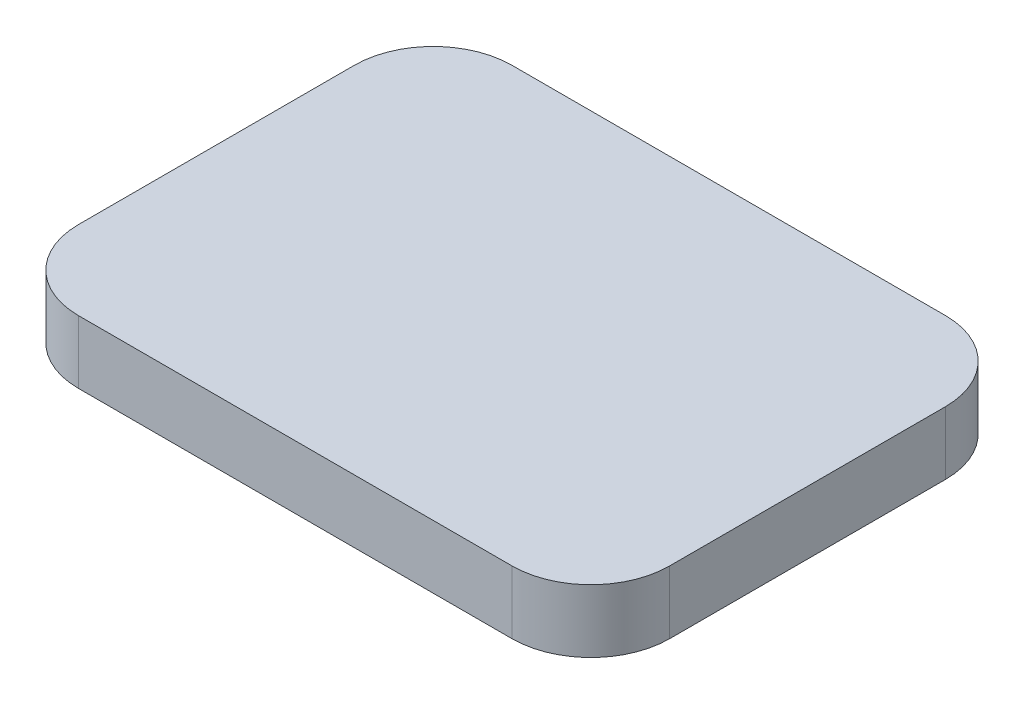
ISO-10303-21;
HEADER;
FILE_DESCRIPTION(('STEP AP214'),'2;1');
FILE_NAME('part.step','',(''),(''),'','','');
FILE_SCHEMA(('AUTOMOTIVE_DESIGN { 1 0 10303 214 1 1 1 1 }'));
ENDSEC;
DATA;
#1=APPLICATION_CONTEXT('core data for automotive mechanical design processes');
#2=APPLICATION_PROTOCOL_DEFINITION('international standard','automotive_design',2000,#1);
#3=PRODUCT_CONTEXT('',#1,'mechanical');
#4=PRODUCT('Part','Part','',(#3));
#5=PRODUCT_RELATED_PRODUCT_CATEGORY('part','',(#4));
#6=PRODUCT_DEFINITION_FORMATION('','',#4);
#7=PRODUCT_DEFINITION_CONTEXT('part definition',#1,'design');
#8=PRODUCT_DEFINITION('design','',#6,#7);
#9=PRODUCT_DEFINITION_SHAPE('','',#8);
#10=(LENGTH_UNIT() NAMED_UNIT(*) SI_UNIT(.MILLI.,.METRE.));
#11=(NAMED_UNIT(*) PLANE_ANGLE_UNIT() SI_UNIT($,.RADIAN.));
#12=(NAMED_UNIT(*) SI_UNIT($,.STERADIAN.) SOLID_ANGLE_UNIT());
#13=UNCERTAINTY_MEASURE_WITH_UNIT(LENGTH_MEASURE(1.E-05),#10,'distance_accuracy_value','');
#14=(GEOMETRIC_REPRESENTATION_CONTEXT(3) GLOBAL_UNCERTAINTY_ASSIGNED_CONTEXT((#13)) GLOBAL_UNIT_ASSIGNED_CONTEXT((#10,
#11,#12)) REPRESENTATION_CONTEXT('',''));
#15=CARTESIAN_POINT('',(0.,0.,0.));
#16=DIRECTION('',(0.,0.,1.));
#17=DIRECTION('',(1.,0.,0.));
#18=AXIS2_PLACEMENT_3D('',#15,#16,#17);
#19=CARTESIAN_POINT('',(7.5,1.6,-5.5));
#20=DIRECTION('',(-1.,0.,0.));
#21=DIRECTION('',(0.,0.,1.));
#22=AXIS2_PLACEMENT_3D('',#19,#20,#21);
#23=PLANE('',#22);
#24=DIRECTION('',(0.,0.,-1.));
#25=VECTOR('',#24,1.);
#26=CARTESIAN_POINT('',(7.5,0.,-5.5));
#27=LINE('',#26,#25);
#28=CARTESIAN_POINT('',(7.5,0.,3.5));
#29=VERTEX_POINT('',#28);
#30=CARTESIAN_POINT('',(7.5,0.,-3.5));
#31=VERTEX_POINT('',#30);
#32=EDGE_CURVE('E130',#29,#31,#27,.T.);
#33=ORIENTED_EDGE('',*,*,#32,.T.);
#34=DIRECTION('',(0.,-1.,0.));
#35=VECTOR('',#34,1.);
#36=CARTESIAN_POINT('',(7.5,1.6,-3.5));
#37=LINE('',#36,#35);
#38=CARTESIAN_POINT('',(7.5,1.6,-3.5));
#39=VERTEX_POINT('',#38);
#40=EDGE_CURVE('E152',#31,#39,#37,.F.);
#41=ORIENTED_EDGE('',*,*,#40,.T.);
#42=DIRECTION('',(0.,0.,-1.));
#43=VECTOR('',#42,1.);
#44=CARTESIAN_POINT('',(7.5,1.6,-5.5));
#45=LINE('',#44,#43);
#46=CARTESIAN_POINT('',(7.5,1.6,3.5));
#47=VERTEX_POINT('',#46);
#48=EDGE_CURVE('E128',#47,#39,#45,.T.);
#49=ORIENTED_EDGE('',*,*,#48,.F.);
#50=DIRECTION('',(0.,-1.,0.));
#51=VECTOR('',#50,1.);
#52=CARTESIAN_POINT('',(7.5,1.6,3.5));
#53=LINE('',#52,#51);
#54=EDGE_CURVE('E149',#47,#29,#53,.T.);
#55=ORIENTED_EDGE('',*,*,#54,.T.);
#56=EDGE_LOOP('',(#33,#41,#49,#55));
#57=FACE_BOUND('',#56,.T.);
#58=ADVANCED_FACE('F33',(#57),#23,.F.);
#59=CARTESIAN_POINT('',(-7.5,1.6,-5.5));
#60=DIRECTION('',(0.,0.,1.));
#61=DIRECTION('',(1.,0.,0.));
#62=AXIS2_PLACEMENT_3D('',#59,#60,#61);
#63=PLANE('',#62);
#64=DIRECTION('',(-1.,0.,0.));
#65=VECTOR('',#64,1.);
#66=CARTESIAN_POINT('',(-7.5,0.,-5.5));
#67=LINE('',#66,#65);
#68=CARTESIAN_POINT('',(5.5,0.,-5.5));
#69=VERTEX_POINT('',#68);
#70=CARTESIAN_POINT('',(-5.5,0.,-5.5));
#71=VERTEX_POINT('',#70);
#72=EDGE_CURVE('E126',#69,#71,#67,.T.);
#73=ORIENTED_EDGE('',*,*,#72,.T.);
#74=DIRECTION('',(0.,-1.,0.));
#75=VECTOR('',#74,1.);
#76=CARTESIAN_POINT('',(-5.5,1.6,-5.5));
#77=LINE('',#76,#75);
#78=CARTESIAN_POINT('',(-5.5,1.6,-5.5));
#79=VERTEX_POINT('',#78);
#80=EDGE_CURVE('E104',#71,#79,#77,.F.);
#81=ORIENTED_EDGE('',*,*,#80,.T.);
#82=DIRECTION('',(-1.,0.,0.));
#83=VECTOR('',#82,1.);
#84=CARTESIAN_POINT('',(-7.5,1.6,-5.5));
#85=LINE('',#84,#83);
#86=CARTESIAN_POINT('',(5.5,1.6,-5.5));
#87=VERTEX_POINT('',#86);
#88=EDGE_CURVE('E166',#87,#79,#85,.T.);
#89=ORIENTED_EDGE('',*,*,#88,.F.);
#90=DIRECTION('',(0.,-1.,0.));
#91=VECTOR('',#90,1.);
#92=CARTESIAN_POINT('',(5.5,1.6,-5.5));
#93=LINE('',#92,#91);
#94=EDGE_CURVE('E109',#87,#69,#93,.T.);
#95=ORIENTED_EDGE('',*,*,#94,.T.);
#96=EDGE_LOOP('',(#73,#81,#89,#95));
#97=FACE_BOUND('',#96,.T.);
#98=ADVANCED_FACE('F171',(#97),#63,.F.);
#99=CARTESIAN_POINT('',(-7.5,1.6,-5.5));
#100=DIRECTION('',(1.,0.,0.));
#101=DIRECTION('',(0.,0.,-1.));
#102=AXIS2_PLACEMENT_3D('',#99,#100,#101);
#103=PLANE('',#102);
#104=DIRECTION('',(0.,0.,1.));
#105=VECTOR('',#104,1.);
#106=CARTESIAN_POINT('',(-7.5,1.6,-5.5));
#107=LINE('',#106,#105);
#108=CARTESIAN_POINT('',(-7.5,1.6,-3.5));
#109=VERTEX_POINT('',#108);
#110=CARTESIAN_POINT('',(-7.5,1.6,3.5));
#111=VERTEX_POINT('',#110);
#112=EDGE_CURVE('E118',#109,#111,#107,.T.);
#113=ORIENTED_EDGE('',*,*,#112,.F.);
#114=DIRECTION('',(0.,-1.,0.));
#115=VECTOR('',#114,1.);
#116=CARTESIAN_POINT('',(-7.5,1.6,-3.5));
#117=LINE('',#116,#115);
#118=CARTESIAN_POINT('',(-7.5,0.,-3.5));
#119=VERTEX_POINT('',#118);
#120=EDGE_CURVE('E103',#109,#119,#117,.T.);
#121=ORIENTED_EDGE('',*,*,#120,.T.);
#122=DIRECTION('',(0.,0.,1.));
#123=VECTOR('',#122,1.);
#124=CARTESIAN_POINT('',(-7.5,0.,-5.5));
#125=LINE('',#124,#123);
#126=CARTESIAN_POINT('',(-7.5,0.,3.5));
#127=VERTEX_POINT('',#126);
#128=EDGE_CURVE('E116',#119,#127,#125,.T.);
#129=ORIENTED_EDGE('',*,*,#128,.T.);
#130=DIRECTION('',(0.,-1.,0.));
#131=VECTOR('',#130,1.);
#132=CARTESIAN_POINT('',(-7.5,1.6,3.5));
#133=LINE('',#132,#131);
#134=EDGE_CURVE('E120',#127,#111,#133,.F.);
#135=ORIENTED_EDGE('',*,*,#134,.T.);
#136=EDGE_LOOP('',(#113,#121,#129,#135));
#137=FACE_BOUND('',#136,.T.);
#138=ADVANCED_FACE('F115',(#137),#103,.F.);
#139=CARTESIAN_POINT('',(-7.5,1.6,5.5));
#140=DIRECTION('',(0.,0.,-1.));
#141=DIRECTION('',(-1.,0.,0.));
#142=AXIS2_PLACEMENT_3D('',#139,#140,#141);
#143=PLANE('',#142);
#144=DIRECTION('',(1.,0.,0.));
#145=VECTOR('',#144,1.);
#146=CARTESIAN_POINT('',(-7.5,1.6,5.5));
#147=LINE('',#146,#145);
#148=CARTESIAN_POINT('',(-5.5,1.6,5.5));
#149=VERTEX_POINT('',#148);
#150=CARTESIAN_POINT('',(5.5,1.6,5.5));
#151=VERTEX_POINT('',#150);
#152=EDGE_CURVE('E134',#149,#151,#147,.T.);
#153=ORIENTED_EDGE('',*,*,#152,.F.);
#154=DIRECTION('',(0.,-1.,0.));
#155=VECTOR('',#154,1.);
#156=CARTESIAN_POINT('',(-5.5,1.6,5.5));
#157=LINE('',#156,#155);
#158=CARTESIAN_POINT('',(-5.5,0.,5.5));
#159=VERTEX_POINT('',#158);
#160=EDGE_CURVE('E11',#149,#159,#157,.T.);
#161=ORIENTED_EDGE('',*,*,#160,.T.);
#162=DIRECTION('',(1.,0.,0.));
#163=VECTOR('',#162,1.);
#164=CARTESIAN_POINT('',(-7.5,0.,5.5));
#165=LINE('',#164,#163);
#166=CARTESIAN_POINT('',(5.5,0.,5.5));
#167=VERTEX_POINT('',#166);
#168=EDGE_CURVE('E125',#159,#167,#165,.T.);
#169=ORIENTED_EDGE('',*,*,#168,.T.);
#170=DIRECTION('',(0.,-1.,0.));
#171=VECTOR('',#170,1.);
#172=CARTESIAN_POINT('',(5.5,1.6,5.5));
#173=LINE('',#172,#171);
#174=EDGE_CURVE('E41',#167,#151,#173,.F.);
#175=ORIENTED_EDGE('',*,*,#174,.T.);
#176=EDGE_LOOP('',(#153,#161,#169,#175));
#177=FACE_BOUND('',#176,.T.);
#178=ADVANCED_FACE('F178',(#177),#143,.F.);
#179=CARTESIAN_POINT('',(0.,1.6,0.));
#180=DIRECTION('',(0.,1.,0.));
#181=DIRECTION('',(0.,0.,1.));
#182=AXIS2_PLACEMENT_3D('',#179,#180,#181);
#183=PLANE('',#182);
#184=ORIENTED_EDGE('',*,*,#88,.T.);
#185=CARTESIAN_POINT('',(-5.5,1.6,-3.5));
#186=DIRECTION('',(0.,1.,0.));
#187=DIRECTION('',(0.,0.,1.));
#188=AXIS2_PLACEMENT_3D('',#185,#186,#187);
#189=CIRCLE('',#188,2.);
#190=EDGE_CURVE('E147',#79,#109,#189,.T.);
#191=ORIENTED_EDGE('',*,*,#190,.T.);
#192=ORIENTED_EDGE('',*,*,#112,.T.);
#193=CARTESIAN_POINT('',(-5.5,1.6,3.5));
#194=DIRECTION('',(0.,1.,0.));
#195=DIRECTION('',(0.,0.,1.));
#196=AXIS2_PLACEMENT_3D('',#193,#194,#195);
#197=CIRCLE('',#196,2.);
#198=EDGE_CURVE('E54',#111,#149,#197,.T.);
#199=ORIENTED_EDGE('',*,*,#198,.T.);
#200=ORIENTED_EDGE('',*,*,#152,.T.);
#201=CARTESIAN_POINT('',(5.5,1.6,3.5));
#202=DIRECTION('',(0.,1.,0.));
#203=DIRECTION('',(0.,0.,1.));
#204=AXIS2_PLACEMENT_3D('',#201,#202,#203);
#205=CIRCLE('',#204,2.);
#206=EDGE_CURVE('E142',#151,#47,#205,.T.);
#207=ORIENTED_EDGE('',*,*,#206,.T.);
#208=ORIENTED_EDGE('',*,*,#48,.T.);
#209=CARTESIAN_POINT('',(5.5,1.6,-3.5));
#210=DIRECTION('',(0.,1.,0.));
#211=DIRECTION('',(0.,0.,1.));
#212=AXIS2_PLACEMENT_3D('',#209,#210,#211);
#213=CIRCLE('',#212,2.);
#214=EDGE_CURVE('E145',#39,#87,#213,.T.);
#215=ORIENTED_EDGE('',*,*,#214,.T.);
#216=EDGE_LOOP('',(#184,#191,#192,#199,#200,#207,#208,#215));
#217=FACE_BOUND('',#216,.T.);
#218=ADVANCED_FACE('F163',(#217),#183,.T.);
#219=CARTESIAN_POINT('',(0.,0.,0.));
#220=DIRECTION('',(0.,1.,0.));
#221=DIRECTION('',(0.,0.,1.));
#222=AXIS2_PLACEMENT_3D('',#219,#220,#221);
#223=PLANE('',#222);
#224=ORIENTED_EDGE('',*,*,#128,.F.);
#225=CARTESIAN_POINT('',(-5.5,0.,-3.5));
#226=DIRECTION('',(0.,1.,0.));
#227=DIRECTION('',(0.,0.,1.));
#228=AXIS2_PLACEMENT_3D('',#225,#226,#227);
#229=CIRCLE('',#228,2.);
#230=EDGE_CURVE('E99',#119,#71,#229,.F.);
#231=ORIENTED_EDGE('',*,*,#230,.T.);
#232=ORIENTED_EDGE('',*,*,#72,.F.);
#233=CARTESIAN_POINT('',(5.5,0.,-3.5));
#234=DIRECTION('',(0.,1.,0.));
#235=DIRECTION('',(0.,0.,1.));
#236=AXIS2_PLACEMENT_3D('',#233,#234,#235);
#237=CIRCLE('',#236,2.);
#238=EDGE_CURVE('E110',#69,#31,#237,.F.);
#239=ORIENTED_EDGE('',*,*,#238,.T.);
#240=ORIENTED_EDGE('',*,*,#32,.F.);
#241=CARTESIAN_POINT('',(5.5,0.,3.5));
#242=DIRECTION('',(0.,1.,0.));
#243=DIRECTION('',(0.,0.,1.));
#244=AXIS2_PLACEMENT_3D('',#241,#242,#243);
#245=CIRCLE('',#244,2.);
#246=EDGE_CURVE('E119',#29,#167,#245,.F.);
#247=ORIENTED_EDGE('',*,*,#246,.T.);
#248=ORIENTED_EDGE('',*,*,#168,.F.);
#249=CARTESIAN_POINT('',(-5.5,0.,3.5));
#250=DIRECTION('',(0.,1.,0.));
#251=DIRECTION('',(0.,0.,1.));
#252=AXIS2_PLACEMENT_3D('',#249,#250,#251);
#253=CIRCLE('',#252,2.);
#254=EDGE_CURVE('E124',#159,#127,#253,.F.);
#255=ORIENTED_EDGE('',*,*,#254,.T.);
#256=EDGE_LOOP('',(#224,#231,#232,#239,#240,#247,#248,#255));
#257=FACE_BOUND('',#256,.T.);
#258=ADVANCED_FACE('F122',(#257),#223,.F.);
#259=CARTESIAN_POINT('',(-5.5,1.6,-3.5));
#260=DIRECTION('',(0.,-1.,0.));
#261=DIRECTION('',(0.,0.,-1.));
#262=AXIS2_PLACEMENT_3D('',#259,#260,#261);
#263=CYLINDRICAL_SURFACE('',#262,2.);
#264=ORIENTED_EDGE('',*,*,#190,.F.);
#265=ORIENTED_EDGE('',*,*,#80,.F.);
#266=ORIENTED_EDGE('',*,*,#230,.F.);
#267=ORIENTED_EDGE('',*,*,#120,.F.);
#268=EDGE_LOOP('',(#264,#265,#266,#267));
#269=FACE_BOUND('',#268,.T.);
#270=ADVANCED_FACE('F102',(#269),#263,.T.);
#271=CARTESIAN_POINT('',(5.5,1.6,-3.5));
#272=DIRECTION('',(0.,-1.,0.));
#273=DIRECTION('',(0.,0.,-1.));
#274=AXIS2_PLACEMENT_3D('',#271,#272,#273);
#275=CYLINDRICAL_SURFACE('',#274,2.);
#276=ORIENTED_EDGE('',*,*,#214,.F.);
#277=ORIENTED_EDGE('',*,*,#40,.F.);
#278=ORIENTED_EDGE('',*,*,#238,.F.);
#279=ORIENTED_EDGE('',*,*,#94,.F.);
#280=EDGE_LOOP('',(#276,#277,#278,#279));
#281=FACE_BOUND('',#280,.T.);
#282=ADVANCED_FACE('F169',(#281),#275,.T.);
#283=CARTESIAN_POINT('',(-5.5,1.6,3.5));
#284=DIRECTION('',(0.,-1.,0.));
#285=DIRECTION('',(0.,0.,-1.));
#286=AXIS2_PLACEMENT_3D('',#283,#284,#285);
#287=CYLINDRICAL_SURFACE('',#286,2.);
#288=ORIENTED_EDGE('',*,*,#198,.F.);
#289=ORIENTED_EDGE('',*,*,#134,.F.);
#290=ORIENTED_EDGE('',*,*,#254,.F.);
#291=ORIENTED_EDGE('',*,*,#160,.F.);
#292=EDGE_LOOP('',(#288,#289,#290,#291));
#293=FACE_BOUND('',#292,.T.);
#294=ADVANCED_FACE('F177',(#293),#287,.T.);
#295=CARTESIAN_POINT('',(5.5,1.6,3.5));
#296=DIRECTION('',(0.,-1.,0.));
#297=DIRECTION('',(0.,0.,-1.));
#298=AXIS2_PLACEMENT_3D('',#295,#296,#297);
#299=CYLINDRICAL_SURFACE('',#298,2.);
#300=ORIENTED_EDGE('',*,*,#206,.F.);
#301=ORIENTED_EDGE('',*,*,#174,.F.);
#302=ORIENTED_EDGE('',*,*,#246,.F.);
#303=ORIENTED_EDGE('',*,*,#54,.F.);
#304=EDGE_LOOP('',(#300,#301,#302,#303));
#305=FACE_BOUND('',#304,.T.);
#306=ADVANCED_FACE('F35',(#305),#299,.T.);
#307=CLOSED_SHELL('',(#58,#98,#138,#178,#218,#258,#270,#282,#294,#306));
#308=MANIFOLD_SOLID_BREP('B2',#307);
#309=ADVANCED_BREP_SHAPE_REPRESENTATION('',(#18,#308),#14);
#310=SHAPE_DEFINITION_REPRESENTATION(#9,#309);
ENDSEC;
END-ISO-10303-21;
